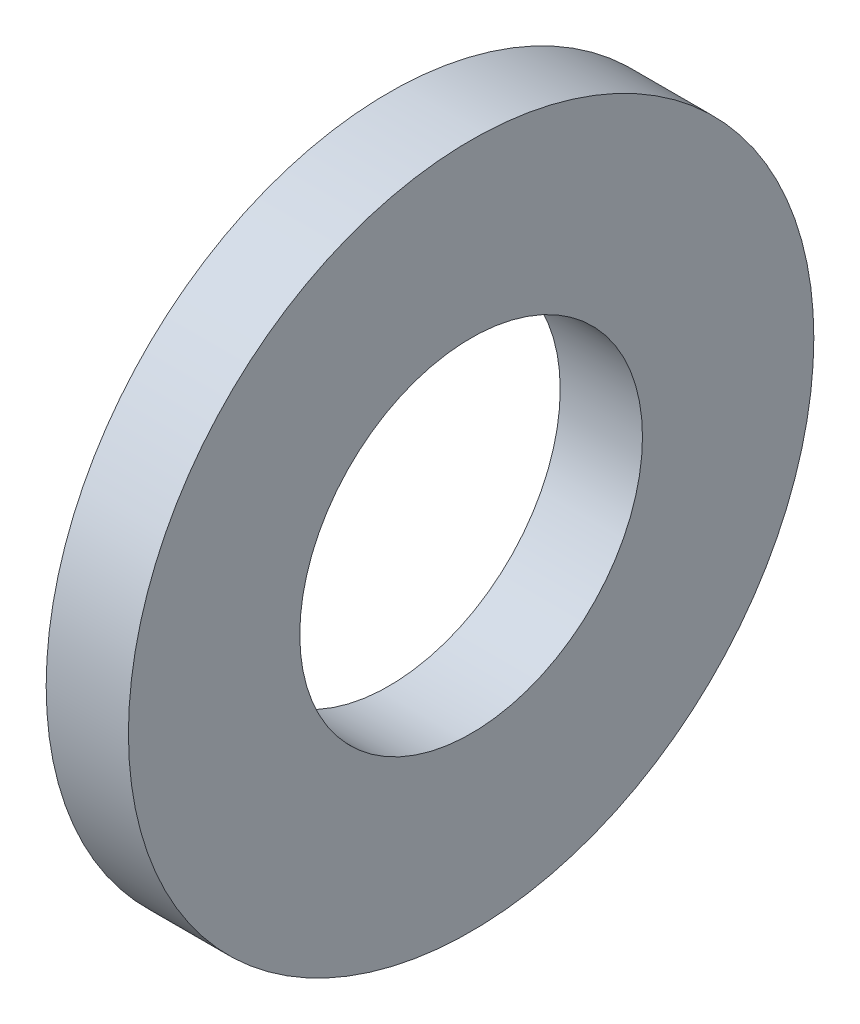
ISO-10303-21;
HEADER;
FILE_DESCRIPTION(('STEP AP214'),'2;1');
FILE_NAME('part.step','',(''),(''),'','','');
FILE_SCHEMA(('AUTOMOTIVE_DESIGN { 1 0 10303 214 1 1 1 1 }'));
ENDSEC;
DATA;
#1=APPLICATION_CONTEXT('core data for automotive mechanical design processes');
#2=APPLICATION_PROTOCOL_DEFINITION('international standard','automotive_design',2000,#1);
#3=PRODUCT_CONTEXT('',#1,'mechanical');
#4=PRODUCT('Part','Part','',(#3));
#5=PRODUCT_RELATED_PRODUCT_CATEGORY('part','',(#4));
#6=PRODUCT_DEFINITION_FORMATION('','',#4);
#7=PRODUCT_DEFINITION_CONTEXT('part definition',#1,'design');
#8=PRODUCT_DEFINITION('design','',#6,#7);
#9=PRODUCT_DEFINITION_SHAPE('','',#8);
#10=(LENGTH_UNIT() NAMED_UNIT(*) SI_UNIT(.MILLI.,.METRE.));
#11=(NAMED_UNIT(*) PLANE_ANGLE_UNIT() SI_UNIT($,.RADIAN.));
#12=(NAMED_UNIT(*) SI_UNIT($,.STERADIAN.) SOLID_ANGLE_UNIT());
#13=UNCERTAINTY_MEASURE_WITH_UNIT(LENGTH_MEASURE(1.E-05),#10,'distance_accuracy_value','');
#14=(GEOMETRIC_REPRESENTATION_CONTEXT(3) GLOBAL_UNCERTAINTY_ASSIGNED_CONTEXT((#13)) GLOBAL_UNIT_ASSIGNED_CONTEXT((#10,
#11,#12)) REPRESENTATION_CONTEXT('',''));
#15=CARTESIAN_POINT('',(0.,0.,0.));
#16=DIRECTION('',(0.,0.,1.));
#17=DIRECTION('',(1.,0.,0.));
#18=AXIS2_PLACEMENT_3D('',#15,#16,#17);
#19=CARTESIAN_POINT('',(2.286,0.,0.));
#20=DIRECTION('',(1.,0.,0.));
#21=DIRECTION('',(0.,0.,-1.));
#22=AXIS2_PLACEMENT_3D('',#19,#20,#21);
#23=PLANE('',#22);
#24=CARTESIAN_POINT('',(2.286,0.,0.));
#25=DIRECTION('',(1.,0.,0.));
#26=DIRECTION('',(0.,0.,-1.));
#27=AXIS2_PLACEMENT_3D('',#24,#25,#26);
#28=CIRCLE('',#27,9.525);
#29=CARTESIAN_POINT('',(2.286,0.,-9.525));
#30=VERTEX_POINT('',#29);
#31=EDGE_CURVE('E10',#30,#30,#28,.T.);
#32=ORIENTED_EDGE('',*,*,#31,.T.);
#33=EDGE_LOOP('',(#32));
#34=FACE_BOUND('',#33,.T.);
#35=CARTESIAN_POINT('',(2.286,0.,0.));
#36=DIRECTION('',(1.,0.,0.));
#37=DIRECTION('',(0.,0.,-1.));
#38=AXIS2_PLACEMENT_3D('',#35,#36,#37);
#39=CIRCLE('',#38,4.7625);
#40=CARTESIAN_POINT('',(2.286,0.,-4.7625));
#41=VERTEX_POINT('',#40);
#42=EDGE_CURVE('E48',#41,#41,#39,.T.);
#43=ORIENTED_EDGE('',*,*,#42,.F.);
#44=EDGE_LOOP('',(#43));
#45=FACE_BOUND('',#44,.T.);
#46=ADVANCED_FACE('F37',(#34,#45),#23,.T.);
#47=CARTESIAN_POINT('',(0.,0.,0.));
#48=DIRECTION('',(1.,0.,0.));
#49=DIRECTION('',(0.,0.,-1.));
#50=AXIS2_PLACEMENT_3D('',#47,#48,#49);
#51=PLANE('',#50);
#52=CARTESIAN_POINT('',(0.,0.,0.));
#53=DIRECTION('',(1.,0.,0.));
#54=DIRECTION('',(0.,0.,-1.));
#55=AXIS2_PLACEMENT_3D('',#52,#53,#54);
#56=CIRCLE('',#55,9.525);
#57=CARTESIAN_POINT('',(0.,0.,-9.525));
#58=VERTEX_POINT('',#57);
#59=EDGE_CURVE('E41',#58,#58,#56,.T.);
#60=ORIENTED_EDGE('',*,*,#59,.F.);
#61=EDGE_LOOP('',(#60));
#62=FACE_BOUND('',#61,.T.);
#63=CARTESIAN_POINT('',(0.,0.,0.));
#64=DIRECTION('',(1.,0.,0.));
#65=DIRECTION('',(0.,0.,-1.));
#66=AXIS2_PLACEMENT_3D('',#63,#64,#65);
#67=CIRCLE('',#66,4.7625);
#68=CARTESIAN_POINT('',(0.,0.,-4.7625));
#69=VERTEX_POINT('',#68);
#70=EDGE_CURVE('E50',#69,#69,#67,.T.);
#71=ORIENTED_EDGE('',*,*,#70,.T.);
#72=EDGE_LOOP('',(#71));
#73=FACE_BOUND('',#72,.T.);
#74=ADVANCED_FACE('F60',(#62,#73),#51,.F.);
#75=CARTESIAN_POINT('',(2.286,0.,0.));
#76=DIRECTION('',(-1.,0.,0.));
#77=DIRECTION('',(0.,0.,1.));
#78=AXIS2_PLACEMENT_3D('',#75,#76,#77);
#79=CYLINDRICAL_SURFACE('',#78,9.525);
#80=ORIENTED_EDGE('',*,*,#31,.F.);
#81=EDGE_LOOP('',(#80));
#82=FACE_BOUND('',#81,.T.);
#83=ORIENTED_EDGE('',*,*,#59,.T.);
#84=EDGE_LOOP('',(#83));
#85=FACE_BOUND('',#84,.T.);
#86=ADVANCED_FACE('F39',(#82,#85),#79,.T.);
#87=CARTESIAN_POINT('',(2.286,0.,0.));
#88=DIRECTION('',(-1.,0.,0.));
#89=DIRECTION('',(0.,0.,1.));
#90=AXIS2_PLACEMENT_3D('',#87,#88,#89);
#91=CYLINDRICAL_SURFACE('',#90,4.7625);
#92=ORIENTED_EDGE('',*,*,#42,.T.);
#93=EDGE_LOOP('',(#92));
#94=FACE_BOUND('',#93,.T.);
#95=ORIENTED_EDGE('',*,*,#70,.F.);
#96=EDGE_LOOP('',(#95));
#97=FACE_BOUND('',#96,.T.);
#98=ADVANCED_FACE('F56',(#94,#97),#91,.F.);
#99=CLOSED_SHELL('',(#46,#74,#86,#98));
#100=MANIFOLD_SOLID_BREP('B2',#99);
#101=ADVANCED_BREP_SHAPE_REPRESENTATION('',(#18,#100),#14);
#102=SHAPE_DEFINITION_REPRESENTATION(#9,#101);
ENDSEC;
END-ISO-10303-21;
